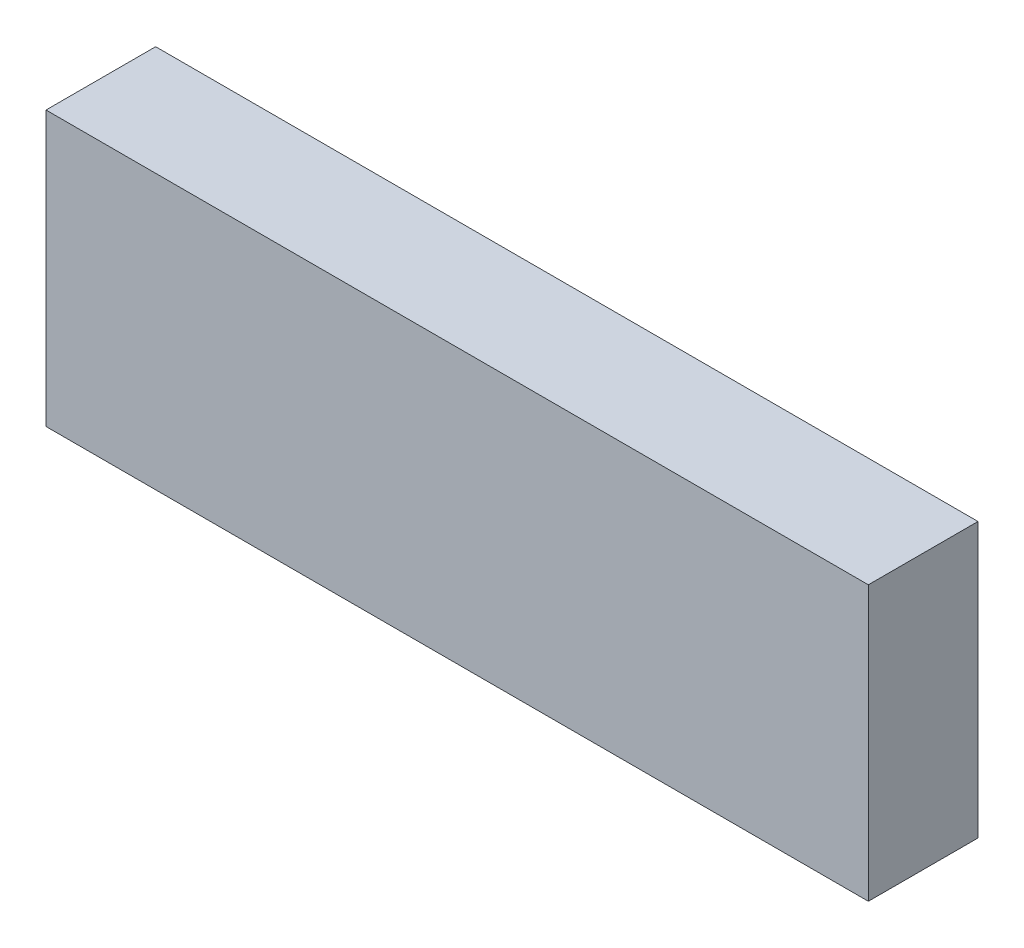
ISO-10303-21;
HEADER;
FILE_DESCRIPTION(('STEP AP214'),'2;1');
FILE_NAME('part.step','',(''),(''),'','','');
FILE_SCHEMA(('AUTOMOTIVE_DESIGN { 1 0 10303 214 1 1 1 1 }'));
ENDSEC;
DATA;
#1=APPLICATION_CONTEXT('core data for automotive mechanical design processes');
#2=APPLICATION_PROTOCOL_DEFINITION('international standard','automotive_design',2000,#1);
#3=PRODUCT_CONTEXT('',#1,'mechanical');
#4=PRODUCT('Part','Part','',(#3));
#5=PRODUCT_RELATED_PRODUCT_CATEGORY('part','',(#4));
#6=PRODUCT_DEFINITION_FORMATION('','',#4);
#7=PRODUCT_DEFINITION_CONTEXT('part definition',#1,'design');
#8=PRODUCT_DEFINITION('design','',#6,#7);
#9=PRODUCT_DEFINITION_SHAPE('','',#8);
#10=(LENGTH_UNIT() NAMED_UNIT(*) SI_UNIT(.MILLI.,.METRE.));
#11=(NAMED_UNIT(*) PLANE_ANGLE_UNIT() SI_UNIT($,.RADIAN.));
#12=(NAMED_UNIT(*) SI_UNIT($,.STERADIAN.) SOLID_ANGLE_UNIT());
#13=UNCERTAINTY_MEASURE_WITH_UNIT(LENGTH_MEASURE(1.E-05),#10,'distance_accuracy_value','');
#14=(GEOMETRIC_REPRESENTATION_CONTEXT(3) GLOBAL_UNCERTAINTY_ASSIGNED_CONTEXT((#13)) GLOBAL_UNIT_ASSIGNED_CONTEXT((#10,
#11,#12)) REPRESENTATION_CONTEXT('',''));
#15=CARTESIAN_POINT('',(0.,0.,0.));
#16=DIRECTION('',(0.,0.,1.));
#17=DIRECTION('',(1.,0.,0.));
#18=AXIS2_PLACEMENT_3D('',#15,#16,#17);
#19=CARTESIAN_POINT('',(75.,-25.,20.));
#20=DIRECTION('',(-1.,0.,0.));
#21=DIRECTION('',(0.,0.,1.));
#22=AXIS2_PLACEMENT_3D('',#19,#20,#21);
#23=PLANE('',#22);
#24=DIRECTION('',(0.,1.,0.));
#25=VECTOR('',#24,1.);
#26=CARTESIAN_POINT('',(75.,-25.,0.));
#27=LINE('',#26,#25);
#28=CARTESIAN_POINT('',(75.,-25.,0.));
#29=VERTEX_POINT('',#28);
#30=CARTESIAN_POINT('',(75.,25.,0.));
#31=VERTEX_POINT('',#30);
#32=EDGE_CURVE('E113',#29,#31,#27,.T.);
#33=ORIENTED_EDGE('',*,*,#32,.T.);
#34=DIRECTION('',(0.,0.,-1.));
#35=VECTOR('',#34,1.);
#36=CARTESIAN_POINT('',(75.,25.,20.));
#37=LINE('',#36,#35);
#38=CARTESIAN_POINT('',(75.,25.,20.));
#39=VERTEX_POINT('',#38);
#40=EDGE_CURVE('E11',#39,#31,#37,.T.);
#41=ORIENTED_EDGE('',*,*,#40,.F.);
#42=DIRECTION('',(0.,1.,0.));
#43=VECTOR('',#42,1.);
#44=CARTESIAN_POINT('',(75.,-25.,20.));
#45=LINE('',#44,#43);
#46=CARTESIAN_POINT('',(75.,-25.,20.));
#47=VERTEX_POINT('',#46);
#48=EDGE_CURVE('E97',#47,#39,#45,.T.);
#49=ORIENTED_EDGE('',*,*,#48,.F.);
#50=DIRECTION('',(0.,0.,-1.));
#51=VECTOR('',#50,1.);
#52=CARTESIAN_POINT('',(75.,-25.,20.));
#53=LINE('',#52,#51);
#54=EDGE_CURVE('E109',#47,#29,#53,.T.);
#55=ORIENTED_EDGE('',*,*,#54,.T.);
#56=EDGE_LOOP('',(#33,#41,#49,#55));
#57=FACE_BOUND('',#56,.T.);
#58=ADVANCED_FACE('F45',(#57),#23,.F.);
#59=CARTESIAN_POINT('',(-75.,25.,20.));
#60=DIRECTION('',(0.,-1.,0.));
#61=DIRECTION('',(0.,0.,-1.));
#62=AXIS2_PLACEMENT_3D('',#59,#60,#61);
#63=PLANE('',#62);
#64=DIRECTION('',(-1.,0.,0.));
#65=VECTOR('',#64,1.);
#66=CARTESIAN_POINT('',(-75.,25.,0.));
#67=LINE('',#66,#65);
#68=CARTESIAN_POINT('',(-75.,25.,0.));
#69=VERTEX_POINT('',#68);
#70=EDGE_CURVE('E102',#31,#69,#67,.T.);
#71=ORIENTED_EDGE('',*,*,#70,.T.);
#72=DIRECTION('',(0.,0.,-1.));
#73=VECTOR('',#72,1.);
#74=CARTESIAN_POINT('',(-75.,25.,20.));
#75=LINE('',#74,#73);
#76=CARTESIAN_POINT('',(-75.,25.,20.));
#77=VERTEX_POINT('',#76);
#78=EDGE_CURVE('E54',#77,#69,#75,.T.);
#79=ORIENTED_EDGE('',*,*,#78,.F.);
#80=DIRECTION('',(-1.,0.,0.));
#81=VECTOR('',#80,1.);
#82=CARTESIAN_POINT('',(-75.,25.,20.));
#83=LINE('',#82,#81);
#84=EDGE_CURVE('E92',#39,#77,#83,.T.);
#85=ORIENTED_EDGE('',*,*,#84,.F.);
#86=ORIENTED_EDGE('',*,*,#40,.T.);
#87=EDGE_LOOP('',(#71,#79,#85,#86));
#88=FACE_BOUND('',#87,.T.);
#89=ADVANCED_FACE('F101',(#88),#63,.F.);
#90=CARTESIAN_POINT('',(-75.,-25.,20.));
#91=DIRECTION('',(1.,0.,0.));
#92=DIRECTION('',(0.,0.,-1.));
#93=AXIS2_PLACEMENT_3D('',#90,#91,#92);
#94=PLANE('',#93);
#95=DIRECTION('',(0.,-1.,0.));
#96=VECTOR('',#95,1.);
#97=CARTESIAN_POINT('',(-75.,-25.,0.));
#98=LINE('',#97,#96);
#99=CARTESIAN_POINT('',(-75.,-25.,0.));
#100=VERTEX_POINT('',#99);
#101=EDGE_CURVE('E79',#69,#100,#98,.T.);
#102=ORIENTED_EDGE('',*,*,#101,.T.);
#103=DIRECTION('',(0.,0.,-1.));
#104=VECTOR('',#103,1.);
#105=CARTESIAN_POINT('',(-75.,-25.,20.));
#106=LINE('',#105,#104);
#107=CARTESIAN_POINT('',(-75.,-25.,20.));
#108=VERTEX_POINT('',#107);
#109=EDGE_CURVE('E104',#108,#100,#106,.T.);
#110=ORIENTED_EDGE('',*,*,#109,.F.);
#111=DIRECTION('',(0.,-1.,0.));
#112=VECTOR('',#111,1.);
#113=CARTESIAN_POINT('',(-75.,-25.,20.));
#114=LINE('',#113,#112);
#115=EDGE_CURVE('E95',#77,#108,#114,.T.);
#116=ORIENTED_EDGE('',*,*,#115,.F.);
#117=ORIENTED_EDGE('',*,*,#78,.T.);
#118=EDGE_LOOP('',(#102,#110,#116,#117));
#119=FACE_BOUND('',#118,.T.);
#120=ADVANCED_FACE('F105',(#119),#94,.F.);
#121=CARTESIAN_POINT('',(-75.,-25.,20.));
#122=DIRECTION('',(0.,1.,0.));
#123=DIRECTION('',(0.,0.,1.));
#124=AXIS2_PLACEMENT_3D('',#121,#122,#123);
#125=PLANE('',#124);
#126=DIRECTION('',(1.,0.,0.));
#127=VECTOR('',#126,1.);
#128=CARTESIAN_POINT('',(-75.,-25.,0.));
#129=LINE('',#128,#127);
#130=EDGE_CURVE('E85',#100,#29,#129,.T.);
#131=ORIENTED_EDGE('',*,*,#130,.T.);
#132=ORIENTED_EDGE('',*,*,#54,.F.);
#133=DIRECTION('',(1.,0.,0.));
#134=VECTOR('',#133,1.);
#135=CARTESIAN_POINT('',(-75.,-25.,20.));
#136=LINE('',#135,#134);
#137=EDGE_CURVE('E62',#108,#47,#136,.T.);
#138=ORIENTED_EDGE('',*,*,#137,.F.);
#139=ORIENTED_EDGE('',*,*,#109,.T.);
#140=EDGE_LOOP('',(#131,#132,#138,#139));
#141=FACE_BOUND('',#140,.T.);
#142=ADVANCED_FACE('F126',(#141),#125,.F.);
#143=CARTESIAN_POINT('',(0.,0.,20.));
#144=DIRECTION('',(0.,0.,-1.));
#145=DIRECTION('',(-1.,0.,0.));
#146=AXIS2_PLACEMENT_3D('',#143,#144,#145);
#147=PLANE('',#146);
#148=ORIENTED_EDGE('',*,*,#48,.T.);
#149=ORIENTED_EDGE('',*,*,#84,.T.);
#150=ORIENTED_EDGE('',*,*,#115,.T.);
#151=ORIENTED_EDGE('',*,*,#137,.T.);
#152=EDGE_LOOP('',(#148,#149,#150,#151));
#153=FACE_BOUND('',#152,.T.);
#154=ADVANCED_FACE('F93',(#153),#147,.F.);
#155=CARTESIAN_POINT('',(0.,0.,0.));
#156=DIRECTION('',(0.,0.,-1.));
#157=DIRECTION('',(-1.,0.,0.));
#158=AXIS2_PLACEMENT_3D('',#155,#156,#157);
#159=PLANE('',#158);
#160=ORIENTED_EDGE('',*,*,#32,.F.);
#161=ORIENTED_EDGE('',*,*,#130,.F.);
#162=ORIENTED_EDGE('',*,*,#101,.F.);
#163=ORIENTED_EDGE('',*,*,#70,.F.);
#164=EDGE_LOOP('',(#160,#161,#162,#163));
#165=FACE_BOUND('',#164,.T.);
#166=ADVANCED_FACE('F129',(#165),#159,.T.);
#167=CLOSED_SHELL('',(#58,#89,#120,#142,#154,#166));
#168=MANIFOLD_SOLID_BREP('B2',#167);
#169=ADVANCED_BREP_SHAPE_REPRESENTATION('',(#18,#168),#14);
#170=SHAPE_DEFINITION_REPRESENTATION(#9,#169);
ENDSEC;
END-ISO-10303-21;
